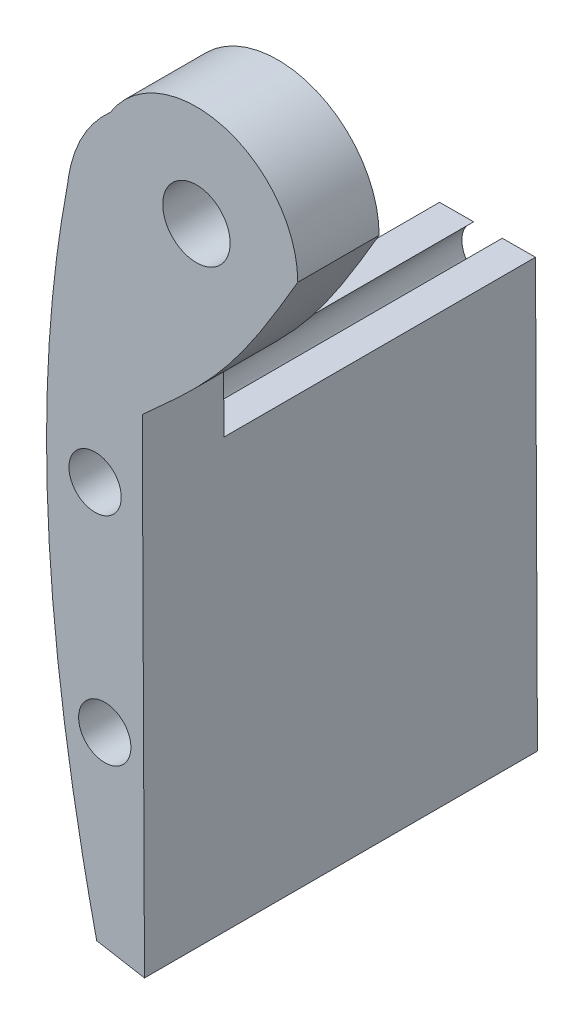
ISO-10303-21;
HEADER;
FILE_DESCRIPTION(('STEP AP214'),'2;1');
FILE_NAME('part.step','',(''),(''),'','','');
FILE_SCHEMA(('AUTOMOTIVE_DESIGN { 1 0 10303 214 1 1 1 1 }'));
ENDSEC;
DATA;
#1=APPLICATION_CONTEXT('core data for automotive mechanical design processes');
#2=APPLICATION_PROTOCOL_DEFINITION('international standard','automotive_design',2000,#1);
#3=PRODUCT_CONTEXT('',#1,'mechanical');
#4=PRODUCT('Part','Part','',(#3));
#5=PRODUCT_RELATED_PRODUCT_CATEGORY('part','',(#4));
#6=PRODUCT_DEFINITION_FORMATION('','',#4);
#7=PRODUCT_DEFINITION_CONTEXT('part definition',#1,'design');
#8=PRODUCT_DEFINITION('design','',#6,#7);
#9=PRODUCT_DEFINITION_SHAPE('','',#8);
#10=(LENGTH_UNIT() NAMED_UNIT(*) SI_UNIT(.MILLI.,.METRE.));
#11=(NAMED_UNIT(*) PLANE_ANGLE_UNIT() SI_UNIT($,.RADIAN.));
#12=(NAMED_UNIT(*) SI_UNIT($,.STERADIAN.) SOLID_ANGLE_UNIT());
#13=UNCERTAINTY_MEASURE_WITH_UNIT(LENGTH_MEASURE(1.E-05),#10,'distance_accuracy_value','');
#14=(GEOMETRIC_REPRESENTATION_CONTEXT(3) GLOBAL_UNCERTAINTY_ASSIGNED_CONTEXT((#13)) GLOBAL_UNIT_ASSIGNED_CONTEXT((#10,
#11,#12)) REPRESENTATION_CONTEXT('',''));
#15=CARTESIAN_POINT('',(0.,0.,0.));
#16=DIRECTION('',(0.,0.,1.));
#17=DIRECTION('',(1.,0.,0.));
#18=AXIS2_PLACEMENT_3D('',#15,#16,#17);
#19=CARTESIAN_POINT('',(-16.6639162338456,-14.6308064254302,-7.));
#20=CARTESIAN_POINT('',(-17.667702323107,-19.8812510451323,-7.));
#21=CARTESIAN_POINT('',(-18.2201315631726,-25.1890374929657,-7.));
#22=CARTESIAN_POINT('',(-18.4013115985762,-30.5145625315888,-7.));
#23=B_SPLINE_CURVE_WITH_KNOTS('',3,(#19,#20,#21,#22),.UNSPECIFIED.,.F.,.F.,(4,4),(0.,
0.288118642181765),.UNSPECIFIED.);
#24=DIRECTION('',(0.,0.,1.));
#25=VECTOR('',#24,1.);
#26=SURFACE_OF_LINEAR_EXTRUSION('',#23,#25);
#27=CARTESIAN_POINT('',(-18.4013115985762,-30.5145625315888,0.));
#28=CARTESIAN_POINT('',(-18.2201315631726,-25.1890374929657,0.));
#29=CARTESIAN_POINT('',(-17.667702323107,-19.8812510451323,0.));
#30=CARTESIAN_POINT('',(-16.6639162338456,-14.6308064254302,0.));
#31=B_SPLINE_CURVE_WITH_KNOTS('',3,(#27,#28,#29,#30),.UNSPECIFIED.,.F.,.F.,(4,4),(0.,
0.288118642181765),.UNSPECIFIED.);
#32=CARTESIAN_POINT('',(-16.6639162338456,-14.6308064254302,0.));
#33=VERTEX_POINT('',#32);
#34=CARTESIAN_POINT('',(-18.4013115985762,-30.5145625315887,0.));
#35=VERTEX_POINT('',#34);
#36=EDGE_CURVE('E170',#33,#35,#31,.F.);
#37=ORIENTED_EDGE('',*,*,#36,.F.);
#38=DIRECTION('',(0.,0.,1.));
#39=VECTOR('',#38,1.);
#40=CARTESIAN_POINT('',(-16.6639162338456,-14.6308064254302,-7.));
#41=LINE('',#40,#39);
#42=CARTESIAN_POINT('',(-16.6639162338456,-14.6308064254302,-7.));
#43=VERTEX_POINT('',#42);
#44=EDGE_CURVE('E11',#43,#33,#41,.T.);
#45=ORIENTED_EDGE('',*,*,#44,.F.);
#46=CARTESIAN_POINT('',(-16.6639162338456,-14.6308064254302,-7.));
#47=CARTESIAN_POINT('',(-17.667702323107,-19.8812510451323,-7.));
#48=CARTESIAN_POINT('',(-18.2201315631726,-25.1890374929657,-7.));
#49=CARTESIAN_POINT('',(-18.4013115985762,-30.5145625315888,-7.));
#50=B_SPLINE_CURVE_WITH_KNOTS('',3,(#46,#47,#48,#49),.UNSPECIFIED.,.F.,.F.,(4,4),(0.,
0.288118642181765),.UNSPECIFIED.);
#51=CARTESIAN_POINT('',(-18.4013115985762,-30.5145625315887,-7.));
#52=VERTEX_POINT('',#51);
#53=EDGE_CURVE('E197',#43,#52,#50,.T.);
#54=ORIENTED_EDGE('',*,*,#53,.T.);
#55=DIRECTION('',(0.,0.,1.));
#56=VECTOR('',#55,1.);
#57=CARTESIAN_POINT('',(-18.4013115985762,-30.5145625315887,-7.));
#58=LINE('',#57,#56);
#59=EDGE_CURVE('E249',#52,#35,#58,.T.);
#60=ORIENTED_EDGE('',*,*,#59,.T.);
#61=EDGE_LOOP('',(#37,#45,#54,#60));
#62=FACE_BOUND('',#61,.T.);
#63=ADVANCED_FACE('F42',(#62),#26,.T.);
#64=CARTESIAN_POINT('',(-12.9861837221063,-7.40648895480318,-7.));
#65=CARTESIAN_POINT('',(-16.1577958352121,-10.2367637695111,-7.));
#66=CARTESIAN_POINT('',(-16.6639162338456,-14.6308064254302,-7.));
#67=B_SPLINE_CURVE_WITH_KNOTS('',2,(#64,#65,#66),.UNSPECIFIED.,.F.,.F.,(3,3),(0.,1.),.UNSPECIFIED.);
#68=DIRECTION('',(0.,0.,1.));
#69=VECTOR('',#68,1.);
#70=SURFACE_OF_LINEAR_EXTRUSION('',#67,#69);
#71=CARTESIAN_POINT('',(-12.9861837221063,-7.40648895480318,0.));
#72=CARTESIAN_POINT('',(-16.1577958352121,-10.2367637695111,0.));
#73=CARTESIAN_POINT('',(-16.6639162338456,-14.6308064254302,0.));
#74=B_SPLINE_CURVE_WITH_KNOTS('',2,(#71,#72,#73),.UNSPECIFIED.,.F.,.F.,(3,3),(0.,1.),.UNSPECIFIED.);
#75=CARTESIAN_POINT('',(-12.9861837221063,-7.40648895480318,0.));
#76=VERTEX_POINT('',#75);
#77=EDGE_CURVE('E288',#76,#33,#74,.T.);
#78=ORIENTED_EDGE('',*,*,#77,.F.);
#79=DIRECTION('',(0.,0.,1.));
#80=VECTOR('',#79,1.);
#81=CARTESIAN_POINT('',(-12.9861837221063,-7.40648895480318,-7.));
#82=LINE('',#81,#80);
#83=CARTESIAN_POINT('',(-12.9861837221063,-7.40648895480318,-7.));
#84=VERTEX_POINT('',#83);
#85=EDGE_CURVE('E55',#84,#76,#82,.T.);
#86=ORIENTED_EDGE('',*,*,#85,.F.);
#87=EDGE_CURVE('E245',#84,#43,#67,.T.);
#88=ORIENTED_EDGE('',*,*,#87,.T.);
#89=ORIENTED_EDGE('',*,*,#44,.T.);
#90=EDGE_LOOP('',(#78,#86,#88,#89));
#91=FACE_BOUND('',#90,.T.);
#92=ADVANCED_FACE('F225',(#91),#70,.T.);
#93=CARTESIAN_POINT('',(-5.57162803204002,-11.9999999999996,-7.));
#94=DIRECTION('',(0.,0.,1.));
#95=DIRECTION('',(1.,0.,0.));
#96=AXIS2_PLACEMENT_3D('',#93,#94,#95);
#97=CYLINDRICAL_SURFACE('',#96,8.722154539071);
#98=CARTESIAN_POINT('',(-5.57162803204002,-11.9999999999996,0.));
#99=DIRECTION('',(0.,0.,1.));
#100=DIRECTION('',(1.,0.,0.));
#101=AXIS2_PLACEMENT_3D('',#98,#99,#100);
#102=CIRCLE('',#101,8.722154539071);
#103=CARTESIAN_POINT('',(3.15052650703097,-11.9999999999996,0.));
#104=VERTEX_POINT('',#103);
#105=EDGE_CURVE('E329',#104,#76,#102,.T.);
#106=ORIENTED_EDGE('',*,*,#105,.F.);
#107=DIRECTION('',(0.,0.,1.));
#108=VECTOR('',#107,1.);
#109=CARTESIAN_POINT('',(3.15052650703097,-11.9999999999996,-7.));
#110=LINE('',#109,#108);
#111=CARTESIAN_POINT('',(3.15052650703097,-11.9999999999996,-7.));
#112=VERTEX_POINT('',#111);
#113=EDGE_CURVE('E295',#112,#104,#110,.T.);
#114=ORIENTED_EDGE('',*,*,#113,.F.);
#115=CARTESIAN_POINT('',(-5.57162803204002,-11.9999999999996,-7.));
#116=DIRECTION('',(0.,0.,1.));
#117=DIRECTION('',(1.,0.,0.));
#118=AXIS2_PLACEMENT_3D('',#115,#116,#117);
#119=CIRCLE('',#118,8.722154539071);
#120=EDGE_CURVE('E237',#112,#84,#119,.T.);
#121=ORIENTED_EDGE('',*,*,#120,.T.);
#122=ORIENTED_EDGE('',*,*,#85,.T.);
#123=EDGE_LOOP('',(#106,#114,#121,#122));
#124=FACE_BOUND('',#123,.T.);
#125=ADVANCED_FACE('F229',(#124),#97,.T.);
#126=CARTESIAN_POINT('',(-10.2316008179203,-28.548135162408,-7.));
#127=CARTESIAN_POINT('',(-7.86437332426008,-26.4272964203006,-7.));
#128=CARTESIAN_POINT('',(-2.52235469825568,-21.6412925007652,-7.));
#129=CARTESIAN_POINT('',(1.12142674466251,-15.4485376326927,-7.));
#130=CARTESIAN_POINT('',(3.15052650703097,-11.9999999999996,-7.));
#131=B_SPLINE_CURVE_WITH_KNOTS('',3,(#126,#127,#128,#129,#130),.UNSPECIFIED.,.F.,.F.,(4,1,4),
(0.,0.443133515509802,1.),.UNSPECIFIED.);
#132=DIRECTION('',(0.,0.,1.));
#133=VECTOR('',#132,1.);
#134=SURFACE_OF_LINEAR_EXTRUSION('',#131,#133);
#135=CARTESIAN_POINT('',(-10.2316008179203,-28.548135162408,0.));
#136=CARTESIAN_POINT('',(-7.86437332426008,-26.4272964203006,0.));
#137=CARTESIAN_POINT('',(-2.52235469825568,-21.6412925007652,0.));
#138=CARTESIAN_POINT('',(1.12142674466251,-15.4485376326927,0.));
#139=CARTESIAN_POINT('',(3.15052650703097,-11.9999999999996,0.));
#140=B_SPLINE_CURVE_WITH_KNOTS('',3,(#135,#136,#137,#138,#139),.UNSPECIFIED.,.F.,.F.,(4,1,4),
(0.,0.443133515509802,1.),.UNSPECIFIED.);
#141=CARTESIAN_POINT('',(-10.2316008179203,-28.548135162408,0.));
#142=VERTEX_POINT('',#141);
#143=EDGE_CURVE('E333',#142,#104,#140,.T.);
#144=ORIENTED_EDGE('',*,*,#143,.F.);
#145=DIRECTION('',(0.,0.,1.));
#146=VECTOR('',#145,1.);
#147=CARTESIAN_POINT('',(-10.2316008179203,-28.548135162408,-7.));
#148=LINE('',#147,#146);
#149=CARTESIAN_POINT('',(-10.2316008179203,-28.548135162408,-7.));
#150=VERTEX_POINT('',#149);
#151=EDGE_CURVE('E263',#150,#142,#148,.T.);
#152=ORIENTED_EDGE('',*,*,#151,.F.);
#153=EDGE_CURVE('E300',#150,#112,#131,.T.);
#154=ORIENTED_EDGE('',*,*,#153,.T.);
#155=ORIENTED_EDGE('',*,*,#113,.T.);
#156=EDGE_LOOP('',(#144,#152,#154,#155));
#157=FACE_BOUND('',#156,.T.);
#158=ADVANCED_FACE('F311',(#157),#134,.T.);
#159=CARTESIAN_POINT('',(-10.0398414787974,-70.4384276849433,-7.));
#160=DIRECTION('',(0.999989522698505,0.00457760780494255,0.));
#161=DIRECTION('',(-0.00457760780494255,0.999989522698505,0.));
#162=AXIS2_PLACEMENT_3D('',#159,#160,#161);
#163=PLANE('',#162);
#164=DIRECTION('',(-0.00457760780494255,0.999989522698505,0.));
#165=VECTOR('',#164,1.);
#166=CARTESIAN_POINT('',(-10.0398414787974,-70.4384276849433,0.));
#167=LINE('',#166,#165);
#168=CARTESIAN_POINT('',(-10.0398414787974,-70.4384276849433,0.));
#169=VERTEX_POINT('',#168);
#170=EDGE_CURVE('E347',#169,#142,#167,.T.);
#171=ORIENTED_EDGE('',*,*,#170,.F.);
#172=DIRECTION('',(0.,0.,1.));
#173=VECTOR('',#172,1.);
#174=CARTESIAN_POINT('',(-10.0398414787974,-70.4384276849433,-7.));
#175=LINE('',#174,#173);
#176=CARTESIAN_POINT('',(-10.0398414787973,-70.4384276849433,-33.812432));
#177=VERTEX_POINT('',#176);
#178=EDGE_CURVE('E257',#177,#169,#175,.T.);
#179=ORIENTED_EDGE('',*,*,#178,.F.);
#180=DIRECTION('',(0.00457760780494414,-0.999989522698505,0.));
#181=VECTOR('',#180,1.);
#182=CARTESIAN_POINT('',(-10.2079392060906,-33.7170716305495,-33.812432));
#183=LINE('',#182,#181);
#184=CARTESIAN_POINT('',(-10.2079392060906,-33.7170716305495,-33.812432));
#185=VERTEX_POINT('',#184);
#186=EDGE_CURVE('E372',#185,#177,#183,.T.);
#187=ORIENTED_EDGE('',*,*,#186,.F.);
#188=DIRECTION('',(0.,0.,1.));
#189=VECTOR('',#188,1.);
#190=CARTESIAN_POINT('',(-10.2079392060906,-33.7170716305495,-33.812432));
#191=LINE('',#190,#189);
#192=CARTESIAN_POINT('',(-10.2079392060906,-33.7170716305495,-7.));
#193=VERTEX_POINT('',#192);
#194=EDGE_CURVE('E162',#185,#193,#191,.T.);
#195=ORIENTED_EDGE('',*,*,#194,.T.);
#196=DIRECTION('',(-0.00457760780494255,0.999989522698505,0.));
#197=VECTOR('',#196,1.);
#198=CARTESIAN_POINT('',(-10.0398414787974,-70.4384276849433,-7.));
#199=LINE('',#198,#197);
#200=EDGE_CURVE('E184',#193,#150,#199,.T.);
#201=ORIENTED_EDGE('',*,*,#200,.T.);
#202=ORIENTED_EDGE('',*,*,#151,.T.);
#203=EDGE_LOOP('',(#171,#179,#187,#195,#201,#202));
#204=FACE_BOUND('',#203,.T.);
#205=ADVANCED_FACE('F314',(#204),#163,.T.);
#206=CARTESIAN_POINT('',(-14.1533851889596,-69.7168711338995,-7.));
#207=DIRECTION('',(-0.172772117417386,-0.98496182435824,0.));
#208=DIRECTION('',(0.98496182435824,-0.172772117417386,0.));
#209=AXIS2_PLACEMENT_3D('',#206,#207,#208);
#210=PLANE('',#209);
#211=DIRECTION('',(0.98496182435824,-0.172772117417386,0.));
#212=VECTOR('',#211,1.);
#213=CARTESIAN_POINT('',(-14.1533851889596,-69.7168711338995,0.));
#214=LINE('',#213,#212);
#215=CARTESIAN_POINT('',(-14.1533851889596,-69.7168711338994,0.));
#216=VERTEX_POINT('',#215);
#217=EDGE_CURVE('E238',#216,#169,#214,.T.);
#218=ORIENTED_EDGE('',*,*,#217,.F.);
#219=DIRECTION('',(0.,0.,1.));
#220=VECTOR('',#219,1.);
#221=CARTESIAN_POINT('',(-14.1533851889596,-69.7168711338994,-7.));
#222=LINE('',#221,#220);
#223=CARTESIAN_POINT('',(-14.1533851889596,-69.7168711338994,-7.));
#224=VERTEX_POINT('',#223);
#225=EDGE_CURVE('E252',#224,#216,#222,.T.);
#226=ORIENTED_EDGE('',*,*,#225,.F.);
#227=DIRECTION('',(0.,0.,1.));
#228=VECTOR('',#227,1.);
#229=CARTESIAN_POINT('',(-14.1533851889596,-69.7168711338994,-33.812432));
#230=LINE('',#229,#228);
#231=CARTESIAN_POINT('',(-14.1533851889596,-69.7168711338994,-33.812432));
#232=VERTEX_POINT('',#231);
#233=EDGE_CURVE('E374',#232,#224,#230,.T.);
#234=ORIENTED_EDGE('',*,*,#233,.F.);
#235=DIRECTION('',(-0.984961824358234,0.172772117417422,0.));
#236=VECTOR('',#235,1.);
#237=CARTESIAN_POINT('',(-10.0398414787973,-70.4384276849433,-33.812432));
#238=LINE('',#237,#236);
#239=EDGE_CURVE('E377',#177,#232,#238,.T.);
#240=ORIENTED_EDGE('',*,*,#239,.F.);
#241=ORIENTED_EDGE('',*,*,#178,.T.);
#242=EDGE_LOOP('',(#218,#226,#234,#240,#241));
#243=FACE_BOUND('',#242,.T.);
#244=ADVANCED_FACE('F316',(#243),#210,.T.);
#245=CARTESIAN_POINT('',(-18.4013115985762,-30.5145625315887,-7.));
#246=CARTESIAN_POINT('',(-18.8489698571187,-43.6728294416428,-7.));
#247=CARTESIAN_POINT('',(-17.030220330295,-56.9393871702691,-7.));
#248=CARTESIAN_POINT('',(-14.1533851889596,-69.7168711338994,-7.));
#249=B_SPLINE_CURVE_WITH_KNOTS('',3,(#245,#246,#247,#248),.UNSPECIFIED.,.F.,.F.,(4,4),
(0.288118642181765,1.),.UNSPECIFIED.);
#250=DIRECTION('',(0.,0.,1.));
#251=VECTOR('',#250,1.);
#252=SURFACE_OF_LINEAR_EXTRUSION('',#249,#251);
#253=CARTESIAN_POINT('',(-18.4013115985762,-30.5145625315887,0.));
#254=CARTESIAN_POINT('',(-18.8489698571187,-43.6728294416428,0.));
#255=CARTESIAN_POINT('',(-17.030220330295,-56.9393871702691,0.));
#256=CARTESIAN_POINT('',(-14.1533851889596,-69.7168711338994,0.));
#257=B_SPLINE_CURVE_WITH_KNOTS('',3,(#253,#254,#255,#256),.UNSPECIFIED.,.F.,.F.,(4,4),
(0.288118642181765,1.),.UNSPECIFIED.);
#258=EDGE_CURVE('E327',#35,#216,#257,.T.);
#259=ORIENTED_EDGE('',*,*,#258,.F.);
#260=ORIENTED_EDGE('',*,*,#59,.F.);
#261=CARTESIAN_POINT('',(-18.4663935069069,-33.7548759910606,-7.));
#262=VERTEX_POINT('',#261);
#263=EDGE_CURVE('E193',#52,#262,#249,.T.);
#264=ORIENTED_EDGE('',*,*,#263,.T.);
#265=CARTESIAN_POINT('',(-14.1533851889595,-69.7168711338995,-7.));
#266=CARTESIAN_POINT('',(-16.7942088460878,-57.987633874211,-7.));
#267=CARTESIAN_POINT('',(-18.5434333171568,-45.8462770612342,-7.));
#268=CARTESIAN_POINT('',(-18.4663935069096,-33.7548759915013,-7.));
#269=B_SPLINE_CURVE_WITH_KNOTS('',3,(#265,#266,#267,#268),.UNSPECIFIED.,.F.,.F.,(4,4),
(0.346520381448638,1.),.UNSPECIFIED.);
#270=EDGE_CURVE('E138',#224,#262,#269,.T.);
#271=ORIENTED_EDGE('',*,*,#270,.F.);
#272=ORIENTED_EDGE('',*,*,#225,.T.);
#273=EDGE_LOOP('',(#259,#260,#264,#271,#272));
#274=FACE_BOUND('',#273,.T.);
#275=ADVANCED_FACE('F190',(#274),#252,.T.);
#276=CARTESIAN_POINT('',(-17.8410911864076,-22.5445293214141,-7.));
#277=DIRECTION('',(0.,0.,-1.));
#278=DIRECTION('',(-1.,0.,0.));
#279=AXIS2_PLACEMENT_3D('',#276,#277,#278);
#280=PLANE('',#279);
#281=CARTESIAN_POINT('',(-14.2911061634265,-35.6179263128565,-7.));
#282=DIRECTION('',(0.,0.,-1.));
#283=DIRECTION('',(-1.,0.,0.));
#284=AXIS2_PLACEMENT_3D('',#281,#282,#283);
#285=CIRCLE('',#284,2.25);
#286=CARTESIAN_POINT('',(-15.5326061013344,-33.7414461226668,-7.));
#287=VERTEX_POINT('',#286);
#288=CARTESIAN_POINT('',(-13.0668376562559,-33.7301586835255,-7.));
#289=VERTEX_POINT('',#288);
#290=EDGE_CURVE('E63',#287,#289,#285,.T.);
#291=ORIENTED_EDGE('',*,*,#290,.F.);
#292=DIRECTION('',(0.999989522698505,0.0045776078049149,0.));
#293=VECTOR('',#292,1.);
#294=CARTESIAN_POINT('',(-18.4663935069096,-33.7548759915013,-7.));
#295=LINE('',#294,#293);
#296=EDGE_CURVE('E70',#262,#287,#295,.T.);
#297=ORIENTED_EDGE('',*,*,#296,.F.);
#298=ORIENTED_EDGE('',*,*,#263,.F.);
#299=ORIENTED_EDGE('',*,*,#53,.F.);
#300=ORIENTED_EDGE('',*,*,#87,.F.);
#301=ORIENTED_EDGE('',*,*,#120,.F.);
#302=ORIENTED_EDGE('',*,*,#153,.F.);
#303=ORIENTED_EDGE('',*,*,#200,.F.);
#304=DIRECTION('',(0.999989522698505,0.00457760780494257,0.));
#305=VECTOR('',#304,1.);
#306=CARTESIAN_POINT('',(-13.0668376562559,-33.7301586835255,-7.));
#307=LINE('',#306,#305);
#308=EDGE_CURVE('E135',#289,#193,#307,.T.);
#309=ORIENTED_EDGE('',*,*,#308,.F.);
#310=EDGE_LOOP('',(#291,#297,#298,#299,#300,#301,#302,#303,#309));
#311=FACE_BOUND('',#310,.T.);
#312=CARTESIAN_POINT('',(-5.57162803204002,-11.9999999999996,-7.));
#313=DIRECTION('',(0.,0.,1.));
#314=DIRECTION('',(1.,0.,0.));
#315=AXIS2_PLACEMENT_3D('',#312,#313,#314);
#316=CIRCLE('',#315,2.9);
#317=CARTESIAN_POINT('',(-2.67162803204002,-11.9999999999996,-7.));
#318=VERTEX_POINT('',#317);
#319=EDGE_CURVE('E166',#318,#318,#316,.T.);
#320=ORIENTED_EDGE('',*,*,#319,.T.);
#321=EDGE_LOOP('',(#320));
#322=FACE_BOUND('',#321,.T.);
#323=ADVANCED_FACE('F132',(#311,#322),#280,.T.);
#324=CARTESIAN_POINT('',(-17.8410911864076,-22.5445293214141,0.));
#325=DIRECTION('',(0.,0.,-1.));
#326=DIRECTION('',(-1.,0.,0.));
#327=AXIS2_PLACEMENT_3D('',#324,#325,#326);
#328=PLANE('',#327);
#329=CARTESIAN_POINT('',(-14.2911061634265,-35.6179263128565,0.));
#330=DIRECTION('',(0.,0.,1.));
#331=DIRECTION('',(1.,0.,0.));
#332=AXIS2_PLACEMENT_3D('',#329,#330,#331);
#333=CIRCLE('',#332,2.25);
#334=CARTESIAN_POINT('',(-12.0411061634265,-35.6179263128565,0.));
#335=VERTEX_POINT('',#334);
#336=EDGE_CURVE('E139',#335,#335,#333,.T.);
#337=ORIENTED_EDGE('',*,*,#336,.F.);
#338=EDGE_LOOP('',(#337));
#339=FACE_BOUND('',#338,.T.);
#340=CARTESIAN_POINT('',(-13.4596618619648,-53.8503120663386,0.));
#341=DIRECTION('',(0.,0.,1.));
#342=DIRECTION('',(1.,0.,0.));
#343=AXIS2_PLACEMENT_3D('',#340,#341,#342);
#344=CIRCLE('',#343,2.25);
#345=CARTESIAN_POINT('',(-11.2096618619648,-53.8503120663386,0.));
#346=VERTEX_POINT('',#345);
#347=EDGE_CURVE('E573',#346,#346,#344,.T.);
#348=ORIENTED_EDGE('',*,*,#347,.F.);
#349=EDGE_LOOP('',(#348));
#350=FACE_BOUND('',#349,.T.);
#351=CARTESIAN_POINT('',(-5.57162803204002,-11.9999999999996,0.));
#352=DIRECTION('',(0.,0.,1.));
#353=DIRECTION('',(1.,0.,0.));
#354=AXIS2_PLACEMENT_3D('',#351,#352,#353);
#355=CIRCLE('',#354,2.9);
#356=CARTESIAN_POINT('',(-2.67162803204002,-11.9999999999996,0.));
#357=VERTEX_POINT('',#356);
#358=EDGE_CURVE('E160',#357,#357,#355,.T.);
#359=ORIENTED_EDGE('',*,*,#358,.F.);
#360=EDGE_LOOP('',(#359));
#361=FACE_BOUND('',#360,.T.);
#362=ORIENTED_EDGE('',*,*,#36,.T.);
#363=ORIENTED_EDGE('',*,*,#258,.T.);
#364=ORIENTED_EDGE('',*,*,#217,.T.);
#365=ORIENTED_EDGE('',*,*,#170,.T.);
#366=ORIENTED_EDGE('',*,*,#143,.T.);
#367=ORIENTED_EDGE('',*,*,#105,.T.);
#368=ORIENTED_EDGE('',*,*,#77,.T.);
#369=EDGE_LOOP('',(#362,#363,#364,#365,#366,#367,#368));
#370=FACE_BOUND('',#369,.T.);
#371=ADVANCED_FACE('F211',(#339,#350,#361,#370),#328,.F.);
#372=CARTESIAN_POINT('',(-5.57162803204002,-11.9999999999996,-7.));
#373=DIRECTION('',(0.,0.,1.));
#374=DIRECTION('',(1.,0.,0.));
#375=AXIS2_PLACEMENT_3D('',#372,#373,#374);
#376=CYLINDRICAL_SURFACE('',#375,2.9);
#377=ORIENTED_EDGE('',*,*,#319,.F.);
#378=EDGE_LOOP('',(#377));
#379=FACE_BOUND('',#378,.T.);
#380=ORIENTED_EDGE('',*,*,#358,.T.);
#381=EDGE_LOOP('',(#380));
#382=FACE_BOUND('',#381,.T.);
#383=ADVANCED_FACE('F221',(#379,#382),#376,.F.);
#384=CARTESIAN_POINT('',(-14.1533851889595,-69.7168711338995,-33.812432));
#385=CARTESIAN_POINT('',(-16.7942088460878,-57.987633874211,-33.812432));
#386=CARTESIAN_POINT('',(-18.5434333171568,-45.8462770612342,-33.812432));
#387=CARTESIAN_POINT('',(-18.4663935069096,-33.7548759915013,-33.812432));
#388=B_SPLINE_CURVE_WITH_KNOTS('',3,(#384,#385,#386,#387),.UNSPECIFIED.,.F.,.F.,(4,4),
(0.346520381448638,1.),.UNSPECIFIED.);
#389=DIRECTION('',(0.,0.,1.));
#390=VECTOR('',#389,1.);
#391=SURFACE_OF_LINEAR_EXTRUSION('',#388,#390);
#392=ORIENTED_EDGE('',*,*,#270,.T.);
#393=DIRECTION('',(0.,0.,1.));
#394=VECTOR('',#393,1.);
#395=CARTESIAN_POINT('',(-18.4663935069096,-33.7548759915013,-33.812432));
#396=LINE('',#395,#394);
#397=CARTESIAN_POINT('',(-18.4663935069096,-33.7548759915013,-33.812432));
#398=VERTEX_POINT('',#397);
#399=EDGE_CURVE('E148',#398,#262,#396,.T.);
#400=ORIENTED_EDGE('',*,*,#399,.F.);
#401=EDGE_CURVE('E369',#232,#398,#388,.T.);
#402=ORIENTED_EDGE('',*,*,#401,.F.);
#403=ORIENTED_EDGE('',*,*,#233,.T.);
#404=EDGE_LOOP('',(#392,#400,#402,#403));
#405=FACE_BOUND('',#404,.T.);
#406=ADVANCED_FACE('F409',(#405),#391,.F.);
#407=CARTESIAN_POINT('',(-18.4663935069096,-33.7548759915013,-33.812432));
#408=DIRECTION('',(0.0045776078049149,-0.999989522698505,0.));
#409=DIRECTION('',(0.999989522698505,0.0045776078049149,0.));
#410=AXIS2_PLACEMENT_3D('',#407,#408,#409);
#411=PLANE('',#410);
#412=ORIENTED_EDGE('',*,*,#296,.T.);
#413=DIRECTION('',(0.,0.,1.));
#414=VECTOR('',#413,1.);
#415=CARTESIAN_POINT('',(-15.5326061013345,-33.7414461226668,-33.812432));
#416=LINE('',#415,#414);
#417=CARTESIAN_POINT('',(-15.5326061013345,-33.7414461226668,-33.812432));
#418=VERTEX_POINT('',#417);
#419=EDGE_CURVE('E145',#418,#287,#416,.T.);
#420=ORIENTED_EDGE('',*,*,#419,.F.);
#421=DIRECTION('',(0.999989522698505,0.0045776078049149,0.));
#422=VECTOR('',#421,1.);
#423=CARTESIAN_POINT('',(-18.4663935069096,-33.7548759915013,-33.812432));
#424=LINE('',#423,#422);
#425=EDGE_CURVE('E396',#398,#418,#424,.T.);
#426=ORIENTED_EDGE('',*,*,#425,.F.);
#427=ORIENTED_EDGE('',*,*,#399,.T.);
#428=EDGE_LOOP('',(#412,#420,#426,#427));
#429=FACE_BOUND('',#428,.T.);
#430=ADVANCED_FACE('F144',(#429),#411,.F.);
#431=CARTESIAN_POINT('',(-14.2911061634265,-35.6179263128565,-33.812432));
#432=DIRECTION('',(0.,0.,1.));
#433=DIRECTION('',(1.,0.,0.));
#434=AXIS2_PLACEMENT_3D('',#431,#432,#433);
#435=CYLINDRICAL_SURFACE('',#434,2.25);
#436=ORIENTED_EDGE('',*,*,#419,.T.);
#437=ORIENTED_EDGE('',*,*,#290,.T.);
#438=DIRECTION('',(0.,0.,1.));
#439=VECTOR('',#438,1.);
#440=CARTESIAN_POINT('',(-13.0668376562559,-33.7301586835255,-33.812432));
#441=LINE('',#440,#439);
#442=CARTESIAN_POINT('',(-13.0668376562559,-33.7301586835255,-33.812432));
#443=VERTEX_POINT('',#442);
#444=EDGE_CURVE('E156',#443,#289,#441,.T.);
#445=ORIENTED_EDGE('',*,*,#444,.F.);
#446=CARTESIAN_POINT('',(-14.2911061634265,-35.6179263128565,-33.812432));
#447=DIRECTION('',(0.,0.,1.));
#448=DIRECTION('',(-1.,0.,0.));
#449=AXIS2_PLACEMENT_3D('',#446,#447,#448);
#450=CIRCLE('',#449,2.25);
#451=EDGE_CURVE('E154',#418,#443,#450,.T.);
#452=ORIENTED_EDGE('',*,*,#451,.F.);
#453=EDGE_LOOP('',(#436,#437,#445,#452));
#454=FACE_BOUND('',#453,.T.);
#455=ORIENTED_EDGE('',*,*,#336,.T.);
#456=EDGE_LOOP('',(#455));
#457=FACE_BOUND('',#456,.T.);
#458=ADVANCED_FACE('F152',(#454,#457),#435,.F.);
#459=CARTESIAN_POINT('',(-13.0668376562559,-33.7301586835255,-33.812432));
#460=DIRECTION('',(0.00457760780494257,-0.999989522698505,0.));
#461=DIRECTION('',(0.999989522698505,0.00457760780494257,0.));
#462=AXIS2_PLACEMENT_3D('',#459,#460,#461);
#463=PLANE('',#462);
#464=ORIENTED_EDGE('',*,*,#308,.T.);
#465=ORIENTED_EDGE('',*,*,#194,.F.);
#466=DIRECTION('',(0.999989522698505,0.00457760780494257,0.));
#467=VECTOR('',#466,1.);
#468=CARTESIAN_POINT('',(-13.0668376562559,-33.7301586835255,-33.812432));
#469=LINE('',#468,#467);
#470=EDGE_CURVE('E391',#443,#185,#469,.T.);
#471=ORIENTED_EDGE('',*,*,#470,.F.);
#472=ORIENTED_EDGE('',*,*,#444,.T.);
#473=EDGE_LOOP('',(#464,#465,#471,#472));
#474=FACE_BOUND('',#473,.T.);
#475=ADVANCED_FACE('F365',(#474),#463,.F.);
#476=CARTESIAN_POINT('',(-17.3290881482004,-51.8716849914671,-33.812432));
#477=DIRECTION('',(0.,0.,1.));
#478=DIRECTION('',(1.,0.,0.));
#479=AXIS2_PLACEMENT_3D('',#476,#477,#478);
#480=PLANE('',#479);
#481=CARTESIAN_POINT('',(-13.4596618619648,-53.8503120663386,-33.812432));
#482=DIRECTION('',(0.,0.,1.));
#483=DIRECTION('',(1.,0.,0.));
#484=AXIS2_PLACEMENT_3D('',#481,#482,#483);
#485=CIRCLE('',#484,2.25);
#486=CARTESIAN_POINT('',(-11.2096618619648,-53.8503120663386,-33.812432));
#487=VERTEX_POINT('',#486);
#488=EDGE_CURVE('E570',#487,#487,#485,.T.);
#489=ORIENTED_EDGE('',*,*,#488,.T.);
#490=EDGE_LOOP('',(#489));
#491=FACE_BOUND('',#490,.T.);
#492=ORIENTED_EDGE('',*,*,#401,.T.);
#493=ORIENTED_EDGE('',*,*,#425,.T.);
#494=ORIENTED_EDGE('',*,*,#451,.T.);
#495=ORIENTED_EDGE('',*,*,#470,.T.);
#496=ORIENTED_EDGE('',*,*,#186,.T.);
#497=ORIENTED_EDGE('',*,*,#239,.T.);
#498=EDGE_LOOP('',(#492,#493,#494,#495,#496,#497));
#499=FACE_BOUND('',#498,.T.);
#500=ADVANCED_FACE('F462',(#491,#499),#480,.F.);
#501=CARTESIAN_POINT('',(-13.4596618619648,-53.8503120663386,-33.812432));
#502=DIRECTION('',(0.,0.,1.));
#503=DIRECTION('',(1.,0.,0.));
#504=AXIS2_PLACEMENT_3D('',#501,#502,#503);
#505=CYLINDRICAL_SURFACE('',#504,2.25);
#506=ORIENTED_EDGE('',*,*,#488,.F.);
#507=EDGE_LOOP('',(#506));
#508=FACE_BOUND('',#507,.T.);
#509=ORIENTED_EDGE('',*,*,#347,.T.);
#510=EDGE_LOOP('',(#509));
#511=FACE_BOUND('',#510,.T.);
#512=ADVANCED_FACE('F471',(#508,#511),#505,.F.);
#513=CLOSED_SHELL('',(#63,#92,#125,#158,#205,#244,#275,#323,#371,#383,#406,#430,#458,#475,#500,#512));
#514=MANIFOLD_SOLID_BREP('B2',#513);
#515=ADVANCED_BREP_SHAPE_REPRESENTATION('',(#18,#514),#14);
#516=SHAPE_DEFINITION_REPRESENTATION(#9,#515);
ENDSEC;
END-ISO-10303-21;
